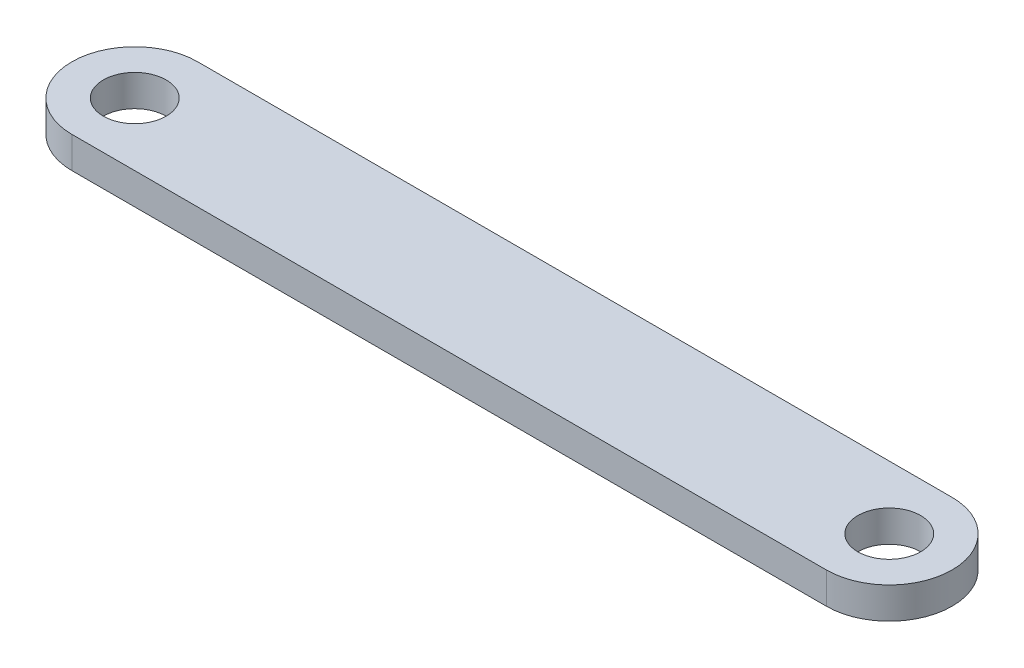
ISO-10303-21;
HEADER;
FILE_DESCRIPTION(('STEP AP214'),'2;1');
FILE_NAME('part.step','',(''),(''),'','','');
FILE_SCHEMA(('AUTOMOTIVE_DESIGN { 1 0 10303 214 1 1 1 1 }'));
ENDSEC;
DATA;
#1=APPLICATION_CONTEXT('core data for automotive mechanical design processes');
#2=APPLICATION_PROTOCOL_DEFINITION('international standard','automotive_design',2000,#1);
#3=PRODUCT_CONTEXT('',#1,'mechanical');
#4=PRODUCT('Part','Part','',(#3));
#5=PRODUCT_RELATED_PRODUCT_CATEGORY('part','',(#4));
#6=PRODUCT_DEFINITION_FORMATION('','',#4);
#7=PRODUCT_DEFINITION_CONTEXT('part definition',#1,'design');
#8=PRODUCT_DEFINITION('design','',#6,#7);
#9=PRODUCT_DEFINITION_SHAPE('','',#8);
#10=(LENGTH_UNIT() NAMED_UNIT(*) SI_UNIT(.MILLI.,.METRE.));
#11=(NAMED_UNIT(*) PLANE_ANGLE_UNIT() SI_UNIT($,.RADIAN.));
#12=(NAMED_UNIT(*) SI_UNIT($,.STERADIAN.) SOLID_ANGLE_UNIT());
#13=UNCERTAINTY_MEASURE_WITH_UNIT(LENGTH_MEASURE(1.E-05),#10,'distance_accuracy_value','');
#14=(GEOMETRIC_REPRESENTATION_CONTEXT(3) GLOBAL_UNCERTAINTY_ASSIGNED_CONTEXT((#13)) GLOBAL_UNIT_ASSIGNED_CONTEXT((#10,
#11,#12)) REPRESENTATION_CONTEXT('',''));
#15=CARTESIAN_POINT('',(0.,0.,0.));
#16=DIRECTION('',(0.,0.,1.));
#17=DIRECTION('',(1.,0.,0.));
#18=AXIS2_PLACEMENT_3D('',#15,#16,#17);
#19=CARTESIAN_POINT('',(-60.,5.,0.));
#20=DIRECTION('',(0.,1.,0.));
#21=DIRECTION('',(0.,0.,1.));
#22=AXIS2_PLACEMENT_3D('',#19,#20,#21);
#23=PLANE('',#22);
#24=CARTESIAN_POINT('',(-60.,5.,0.));
#25=DIRECTION('',(0.,1.,0.));
#26=DIRECTION('',(0.,0.,1.));
#27=AXIS2_PLACEMENT_3D('',#24,#25,#26);
#28=CIRCLE('',#27,5.);
#29=CARTESIAN_POINT('',(-60.,5.,5.00000000000001));
#30=VERTEX_POINT('',#29);
#31=EDGE_CURVE('E106',#30,#30,#28,.T.);
#32=ORIENTED_EDGE('',*,*,#31,.F.);
#33=EDGE_LOOP('',(#32));
#34=FACE_BOUND('',#33,.T.);
#35=CARTESIAN_POINT('',(-60.,5.,0.));
#36=DIRECTION('',(0.,1.,0.));
#37=DIRECTION('',(0.,0.,1.));
#38=AXIS2_PLACEMENT_3D('',#35,#36,#37);
#39=CIRCLE('',#38,10.);
#40=CARTESIAN_POINT('',(-60.,5.,-10.));
#41=VERTEX_POINT('',#40);
#42=CARTESIAN_POINT('',(-60.,5.,10.));
#43=VERTEX_POINT('',#42);
#44=EDGE_CURVE('E91',#41,#43,#39,.T.);
#45=ORIENTED_EDGE('',*,*,#44,.T.);
#46=DIRECTION('',(1.,0.,0.));
#47=VECTOR('',#46,1.);
#48=CARTESIAN_POINT('',(-60.,5.,10.));
#49=LINE('',#48,#47);
#50=CARTESIAN_POINT('',(60.,5.,10.));
#51=VERTEX_POINT('',#50);
#52=EDGE_CURVE('E86',#43,#51,#49,.T.);
#53=ORIENTED_EDGE('',*,*,#52,.T.);
#54=CARTESIAN_POINT('',(60.,5.,0.));
#55=DIRECTION('',(0.,1.,0.));
#56=DIRECTION('',(0.,0.,1.));
#57=AXIS2_PLACEMENT_3D('',#54,#55,#56);
#58=CIRCLE('',#57,10.);
#59=CARTESIAN_POINT('',(60.,5.,-10.));
#60=VERTEX_POINT('',#59);
#61=EDGE_CURVE('E89',#51,#60,#58,.T.);
#62=ORIENTED_EDGE('',*,*,#61,.T.);
#63=DIRECTION('',(-1.,0.,0.));
#64=VECTOR('',#63,1.);
#65=CARTESIAN_POINT('',(-60.,5.,-10.));
#66=LINE('',#65,#64);
#67=EDGE_CURVE('E56',#60,#41,#66,.T.);
#68=ORIENTED_EDGE('',*,*,#67,.T.);
#69=EDGE_LOOP('',(#45,#53,#62,#68));
#70=FACE_BOUND('',#69,.T.);
#71=CARTESIAN_POINT('',(60.,5.,0.));
#72=DIRECTION('',(0.,1.,0.));
#73=DIRECTION('',(0.,0.,1.));
#74=AXIS2_PLACEMENT_3D('',#71,#72,#73);
#75=CIRCLE('',#74,5.);
#76=CARTESIAN_POINT('',(60.,5.,5.00000000000001));
#77=VERTEX_POINT('',#76);
#78=EDGE_CURVE('E121',#77,#77,#75,.T.);
#79=ORIENTED_EDGE('',*,*,#78,.F.);
#80=EDGE_LOOP('',(#79));
#81=FACE_BOUND('',#80,.T.);
#82=ADVANCED_FACE('F39',(#34,#70,#81),#23,.T.);
#83=CARTESIAN_POINT('',(-60.,0.,0.));
#84=DIRECTION('',(0.,1.,0.));
#85=DIRECTION('',(0.,0.,1.));
#86=AXIS2_PLACEMENT_3D('',#83,#84,#85);
#87=PLANE('',#86);
#88=CARTESIAN_POINT('',(-60.,0.,0.));
#89=DIRECTION('',(0.,1.,0.));
#90=DIRECTION('',(0.,0.,1.));
#91=AXIS2_PLACEMENT_3D('',#88,#89,#90);
#92=CIRCLE('',#91,10.);
#93=CARTESIAN_POINT('',(-60.,0.,-10.));
#94=VERTEX_POINT('',#93);
#95=CARTESIAN_POINT('',(-60.,0.,10.));
#96=VERTEX_POINT('',#95);
#97=EDGE_CURVE('E103',#94,#96,#92,.T.);
#98=ORIENTED_EDGE('',*,*,#97,.F.);
#99=DIRECTION('',(-1.,0.,0.));
#100=VECTOR('',#99,1.);
#101=CARTESIAN_POINT('',(-60.,0.,-10.));
#102=LINE('',#101,#100);
#103=CARTESIAN_POINT('',(60.,0.,-10.));
#104=VERTEX_POINT('',#103);
#105=EDGE_CURVE('E79',#104,#94,#102,.T.);
#106=ORIENTED_EDGE('',*,*,#105,.F.);
#107=CARTESIAN_POINT('',(60.,0.,0.));
#108=DIRECTION('',(0.,1.,0.));
#109=DIRECTION('',(0.,0.,1.));
#110=AXIS2_PLACEMENT_3D('',#107,#108,#109);
#111=CIRCLE('',#110,10.);
#112=CARTESIAN_POINT('',(60.,0.,10.));
#113=VERTEX_POINT('',#112);
#114=EDGE_CURVE('E73',#113,#104,#111,.T.);
#115=ORIENTED_EDGE('',*,*,#114,.F.);
#116=DIRECTION('',(1.,0.,0.));
#117=VECTOR('',#116,1.);
#118=CARTESIAN_POINT('',(-60.,0.,10.));
#119=LINE('',#118,#117);
#120=EDGE_CURVE('E95',#96,#113,#119,.T.);
#121=ORIENTED_EDGE('',*,*,#120,.F.);
#122=EDGE_LOOP('',(#98,#106,#115,#121));
#123=FACE_BOUND('',#122,.T.);
#124=CARTESIAN_POINT('',(-60.,0.,0.));
#125=DIRECTION('',(0.,1.,0.));
#126=DIRECTION('',(0.,0.,1.));
#127=AXIS2_PLACEMENT_3D('',#124,#125,#126);
#128=CIRCLE('',#127,5.);
#129=CARTESIAN_POINT('',(-60.,0.,5.00000000000001));
#130=VERTEX_POINT('',#129);
#131=EDGE_CURVE('E118',#130,#130,#128,.T.);
#132=ORIENTED_EDGE('',*,*,#131,.T.);
#133=EDGE_LOOP('',(#132));
#134=FACE_BOUND('',#133,.T.);
#135=CARTESIAN_POINT('',(60.,0.,0.));
#136=DIRECTION('',(0.,1.,0.));
#137=DIRECTION('',(0.,0.,1.));
#138=AXIS2_PLACEMENT_3D('',#135,#136,#137);
#139=CIRCLE('',#138,5.);
#140=CARTESIAN_POINT('',(60.,0.,5.00000000000001));
#141=VERTEX_POINT('',#140);
#142=EDGE_CURVE('E124',#141,#141,#139,.T.);
#143=ORIENTED_EDGE('',*,*,#142,.T.);
#144=EDGE_LOOP('',(#143));
#145=FACE_BOUND('',#144,.T.);
#146=ADVANCED_FACE('F114',(#123,#134,#145),#87,.F.);
#147=CARTESIAN_POINT('',(-60.,5.,0.));
#148=DIRECTION('',(0.,-1.,0.));
#149=DIRECTION('',(0.,0.,-1.));
#150=AXIS2_PLACEMENT_3D('',#147,#148,#149);
#151=CYLINDRICAL_SURFACE('',#150,10.);
#152=ORIENTED_EDGE('',*,*,#97,.T.);
#153=DIRECTION('',(0.,-1.,0.));
#154=VECTOR('',#153,1.);
#155=CARTESIAN_POINT('',(-60.,5.,10.));
#156=LINE('',#155,#154);
#157=EDGE_CURVE('E11',#43,#96,#156,.T.);
#158=ORIENTED_EDGE('',*,*,#157,.F.);
#159=ORIENTED_EDGE('',*,*,#44,.F.);
#160=DIRECTION('',(0.,-1.,0.));
#161=VECTOR('',#160,1.);
#162=CARTESIAN_POINT('',(-60.,5.,-10.));
#163=LINE('',#162,#161);
#164=EDGE_CURVE('E99',#41,#94,#163,.T.);
#165=ORIENTED_EDGE('',*,*,#164,.T.);
#166=EDGE_LOOP('',(#152,#158,#159,#165));
#167=FACE_BOUND('',#166,.T.);
#168=ADVANCED_FACE('F41',(#167),#151,.T.);
#169=CARTESIAN_POINT('',(-60.,5.,10.));
#170=DIRECTION('',(0.,0.,-1.));
#171=DIRECTION('',(-1.,0.,0.));
#172=AXIS2_PLACEMENT_3D('',#169,#170,#171);
#173=PLANE('',#172);
#174=ORIENTED_EDGE('',*,*,#120,.T.);
#175=DIRECTION('',(0.,-1.,0.));
#176=VECTOR('',#175,1.);
#177=CARTESIAN_POINT('',(60.,5.,10.));
#178=LINE('',#177,#176);
#179=EDGE_CURVE('E48',#51,#113,#178,.T.);
#180=ORIENTED_EDGE('',*,*,#179,.F.);
#181=ORIENTED_EDGE('',*,*,#52,.F.);
#182=ORIENTED_EDGE('',*,*,#157,.T.);
#183=EDGE_LOOP('',(#174,#180,#181,#182));
#184=FACE_BOUND('',#183,.T.);
#185=ADVANCED_FACE('F94',(#184),#173,.F.);
#186=CARTESIAN_POINT('',(60.,5.,0.));
#187=DIRECTION('',(0.,-1.,0.));
#188=DIRECTION('',(0.,0.,-1.));
#189=AXIS2_PLACEMENT_3D('',#186,#187,#188);
#190=CYLINDRICAL_SURFACE('',#189,10.);
#191=ORIENTED_EDGE('',*,*,#114,.T.);
#192=DIRECTION('',(0.,-1.,0.));
#193=VECTOR('',#192,1.);
#194=CARTESIAN_POINT('',(60.,5.,-10.));
#195=LINE('',#194,#193);
#196=EDGE_CURVE('E96',#60,#104,#195,.T.);
#197=ORIENTED_EDGE('',*,*,#196,.F.);
#198=ORIENTED_EDGE('',*,*,#61,.F.);
#199=ORIENTED_EDGE('',*,*,#179,.T.);
#200=EDGE_LOOP('',(#191,#197,#198,#199));
#201=FACE_BOUND('',#200,.T.);
#202=ADVANCED_FACE('F97',(#201),#190,.T.);
#203=CARTESIAN_POINT('',(-60.,5.,-10.));
#204=DIRECTION('',(0.,0.,1.));
#205=DIRECTION('',(1.,0.,0.));
#206=AXIS2_PLACEMENT_3D('',#203,#204,#205);
#207=PLANE('',#206);
#208=ORIENTED_EDGE('',*,*,#105,.T.);
#209=ORIENTED_EDGE('',*,*,#164,.F.);
#210=ORIENTED_EDGE('',*,*,#67,.F.);
#211=ORIENTED_EDGE('',*,*,#196,.T.);
#212=EDGE_LOOP('',(#208,#209,#210,#211));
#213=FACE_BOUND('',#212,.T.);
#214=ADVANCED_FACE('F111',(#213),#207,.F.);
#215=CARTESIAN_POINT('',(-60.,5.,0.));
#216=DIRECTION('',(0.,-1.,0.));
#217=DIRECTION('',(0.,0.,-1.));
#218=AXIS2_PLACEMENT_3D('',#215,#216,#217);
#219=CYLINDRICAL_SURFACE('',#218,5.);
#220=ORIENTED_EDGE('',*,*,#31,.T.);
#221=EDGE_LOOP('',(#220));
#222=FACE_BOUND('',#221,.T.);
#223=ORIENTED_EDGE('',*,*,#131,.F.);
#224=EDGE_LOOP('',(#223));
#225=FACE_BOUND('',#224,.T.);
#226=ADVANCED_FACE('F141',(#222,#225),#219,.F.);
#227=CARTESIAN_POINT('',(60.,5.,0.));
#228=DIRECTION('',(0.,-1.,0.));
#229=DIRECTION('',(0.,0.,-1.));
#230=AXIS2_PLACEMENT_3D('',#227,#228,#229);
#231=CYLINDRICAL_SURFACE('',#230,5.);
#232=ORIENTED_EDGE('',*,*,#78,.T.);
#233=EDGE_LOOP('',(#232));
#234=FACE_BOUND('',#233,.T.);
#235=ORIENTED_EDGE('',*,*,#142,.F.);
#236=EDGE_LOOP('',(#235));
#237=FACE_BOUND('',#236,.T.);
#238=ADVANCED_FACE('F130',(#234,#237),#231,.F.);
#239=CLOSED_SHELL('',(#82,#146,#168,#185,#202,#214,#226,#238));
#240=MANIFOLD_SOLID_BREP('B2',#239);
#241=ADVANCED_BREP_SHAPE_REPRESENTATION('',(#18,#240),#14);
#242=SHAPE_DEFINITION_REPRESENTATION(#9,#241);
ENDSEC;
END-ISO-10303-21;
